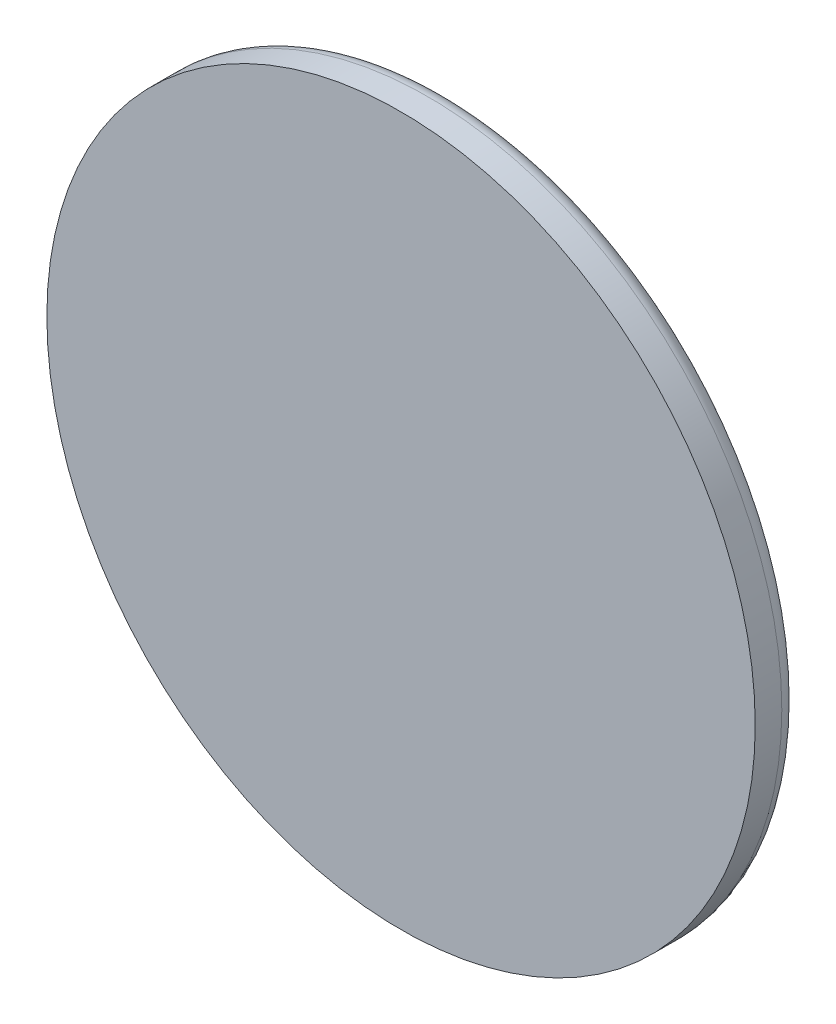
ISO-10303-21;
HEADER;
FILE_DESCRIPTION(('STEP AP214'),'2;1');
FILE_NAME('part.step','',(''),(''),'','','');
FILE_SCHEMA(('AUTOMOTIVE_DESIGN { 1 0 10303 214 1 1 1 1 }'));
ENDSEC;
DATA;
#1=APPLICATION_CONTEXT('core data for automotive mechanical design processes');
#2=APPLICATION_PROTOCOL_DEFINITION('international standard','automotive_design',2000,#1);
#3=PRODUCT_CONTEXT('',#1,'mechanical');
#4=PRODUCT('Part','Part','',(#3));
#5=PRODUCT_RELATED_PRODUCT_CATEGORY('part','',(#4));
#6=PRODUCT_DEFINITION_FORMATION('','',#4);
#7=PRODUCT_DEFINITION_CONTEXT('part definition',#1,'design');
#8=PRODUCT_DEFINITION('design','',#6,#7);
#9=PRODUCT_DEFINITION_SHAPE('','',#8);
#10=(LENGTH_UNIT() NAMED_UNIT(*) SI_UNIT(.MILLI.,.METRE.));
#11=(NAMED_UNIT(*) PLANE_ANGLE_UNIT() SI_UNIT($,.RADIAN.));
#12=(NAMED_UNIT(*) SI_UNIT($,.STERADIAN.) SOLID_ANGLE_UNIT());
#13=UNCERTAINTY_MEASURE_WITH_UNIT(LENGTH_MEASURE(1.E-05),#10,'distance_accuracy_value','');
#14=(GEOMETRIC_REPRESENTATION_CONTEXT(3) GLOBAL_UNCERTAINTY_ASSIGNED_CONTEXT((#13)) GLOBAL_UNIT_ASSIGNED_CONTEXT((#10,
#11,#12)) REPRESENTATION_CONTEXT('',''));
#15=CARTESIAN_POINT('',(0.,0.,0.));
#16=DIRECTION('',(0.,0.,1.));
#17=DIRECTION('',(1.,0.,0.));
#18=AXIS2_PLACEMENT_3D('',#15,#16,#17);
#19=CARTESIAN_POINT('',(-13.1800231334968,8.4476038146269,5.));
#20=DIRECTION('',(0.,0.,-1.));
#21=DIRECTION('',(-1.,0.,0.));
#22=AXIS2_PLACEMENT_3D('',#19,#20,#21);
#23=CYLINDRICAL_SURFACE('',#22,40.);
#24=CARTESIAN_POINT('',(-13.1800231334968,8.4476038146269,2.));
#25=DIRECTION('',(0.,0.,1.));
#26=DIRECTION('',(1.,0.,0.));
#27=AXIS2_PLACEMENT_3D('',#24,#25,#26);
#28=CIRCLE('',#27,40.);
#29=CARTESIAN_POINT('',(26.8199768665032,8.4476038146269,2.));
#30=VERTEX_POINT('',#29);
#31=EDGE_CURVE('E43',#30,#30,#28,.T.);
#32=ORIENTED_EDGE('',*,*,#31,.T.);
#33=EDGE_LOOP('',(#32));
#34=FACE_BOUND('',#33,.T.);
#35=CARTESIAN_POINT('',(-13.1800231334968,8.4476038146269,5.));
#36=DIRECTION('',(0.,0.,1.));
#37=DIRECTION('',(1.,0.,0.));
#38=AXIS2_PLACEMENT_3D('',#35,#36,#37);
#39=CIRCLE('',#38,40.);
#40=CARTESIAN_POINT('',(26.8199768665032,8.4476038146269,5.));
#41=VERTEX_POINT('',#40);
#42=EDGE_CURVE('E47',#41,#41,#39,.T.);
#43=ORIENTED_EDGE('',*,*,#42,.F.);
#44=EDGE_LOOP('',(#43));
#45=FACE_BOUND('',#44,.T.);
#46=ADVANCED_FACE('F36',(#34,#45),#23,.T.);
#47=CARTESIAN_POINT('',(-13.1800231334968,8.4476038146269,5.));
#48=DIRECTION('',(0.,0.,1.));
#49=DIRECTION('',(1.,0.,0.));
#50=AXIS2_PLACEMENT_3D('',#47,#48,#49);
#51=PLANE('',#50);
#52=ORIENTED_EDGE('',*,*,#42,.T.);
#53=EDGE_LOOP('',(#52));
#54=FACE_BOUND('',#53,.T.);
#55=ADVANCED_FACE('F54',(#54),#51,.T.);
#56=CARTESIAN_POINT('',(-13.1800231334968,8.4476038146269,0.));
#57=DIRECTION('',(0.,0.,1.));
#58=DIRECTION('',(1.,0.,0.));
#59=AXIS2_PLACEMENT_3D('',#56,#57,#58);
#60=PLANE('',#59);
#61=CARTESIAN_POINT('',(-13.1800231334968,8.4476038146269,0.));
#62=DIRECTION('',(0.,0.,1.));
#63=DIRECTION('',(1.,0.,0.));
#64=AXIS2_PLACEMENT_3D('',#61,#62,#63);
#65=CIRCLE('',#64,38.);
#66=CARTESIAN_POINT('',(24.8199768665032,8.4476038146269,0.));
#67=VERTEX_POINT('',#66);
#68=EDGE_CURVE('E10',#67,#67,#65,.F.);
#69=ORIENTED_EDGE('',*,*,#68,.T.);
#70=EDGE_LOOP('',(#69));
#71=FACE_BOUND('',#70,.T.);
#72=ADVANCED_FACE('F60',(#71),#60,.F.);
#73=CARTESIAN_POINT('',(-13.1800231334968,8.4476038146269,2.));
#74=DIRECTION('',(0.,0.,1.));
#75=DIRECTION('',(1.,0.,0.));
#76=AXIS2_PLACEMENT_3D('',#73,#74,#75);
#77=TOROIDAL_SURFACE('',#76,38.,2.);
#78=ORIENTED_EDGE('',*,*,#68,.F.);
#79=EDGE_LOOP('',(#78));
#80=FACE_BOUND('',#79,.T.);
#81=ORIENTED_EDGE('',*,*,#31,.F.);
#82=EDGE_LOOP('',(#81));
#83=FACE_BOUND('',#82,.T.);
#84=ADVANCED_FACE('F38',(#80,#83),#77,.T.);
#85=CLOSED_SHELL('',(#46,#55,#72,#84));
#86=MANIFOLD_SOLID_BREP('B2',#85);
#87=ADVANCED_BREP_SHAPE_REPRESENTATION('',(#18,#86),#14);
#88=SHAPE_DEFINITION_REPRESENTATION(#9,#87);
ENDSEC;
END-ISO-10303-21;
